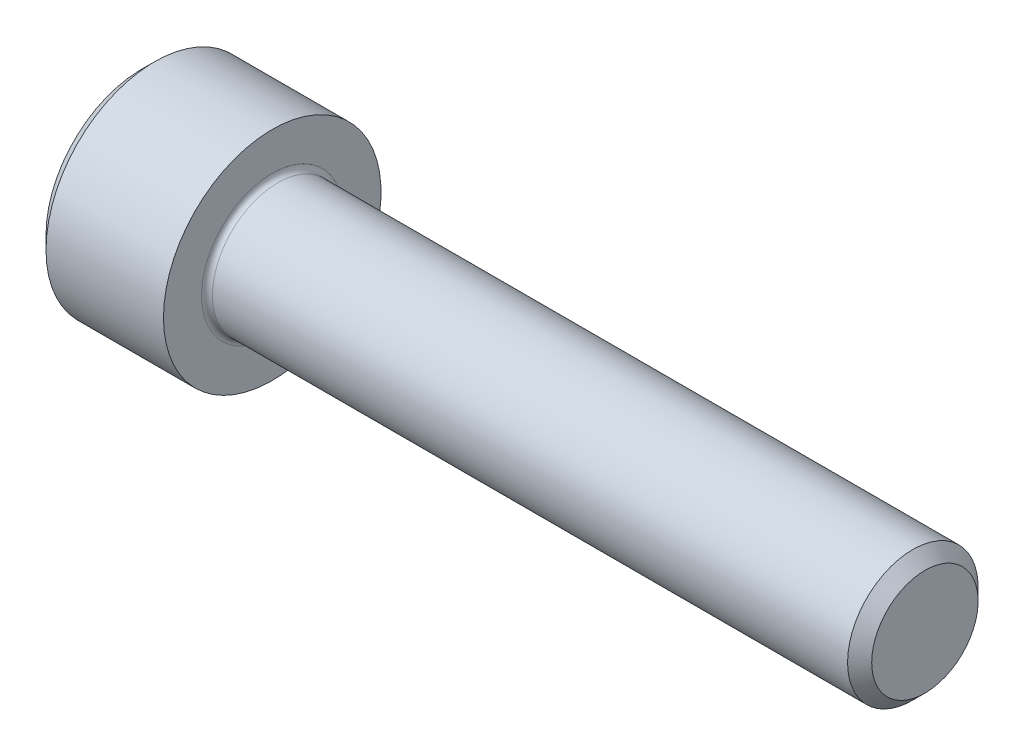
ISO-10303-21;
HEADER;
FILE_DESCRIPTION(('STEP AP214'),'2;1');
FILE_NAME('part.step','',(''),(''),'','','');
FILE_SCHEMA(('AUTOMOTIVE_DESIGN { 1 0 10303 214 1 1 1 1 }'));
ENDSEC;
DATA;
#1=APPLICATION_CONTEXT('core data for automotive mechanical design processes');
#2=APPLICATION_PROTOCOL_DEFINITION('international standard','automotive_design',2000,#1);
#3=PRODUCT_CONTEXT('',#1,'mechanical');
#4=PRODUCT('Part','Part','',(#3));
#5=PRODUCT_RELATED_PRODUCT_CATEGORY('part','',(#4));
#6=PRODUCT_DEFINITION_FORMATION('','',#4);
#7=PRODUCT_DEFINITION_CONTEXT('part definition',#1,'design');
#8=PRODUCT_DEFINITION('design','',#6,#7);
#9=PRODUCT_DEFINITION_SHAPE('','',#8);
#10=(LENGTH_UNIT() NAMED_UNIT(*) SI_UNIT(.MILLI.,.METRE.));
#11=(NAMED_UNIT(*) PLANE_ANGLE_UNIT() SI_UNIT($,.RADIAN.));
#12=(NAMED_UNIT(*) SI_UNIT($,.STERADIAN.) SOLID_ANGLE_UNIT());
#13=UNCERTAINTY_MEASURE_WITH_UNIT(LENGTH_MEASURE(1.E-05),#10,'distance_accuracy_value','');
#14=(GEOMETRIC_REPRESENTATION_CONTEXT(3) GLOBAL_UNCERTAINTY_ASSIGNED_CONTEXT((#13)) GLOBAL_UNIT_ASSIGNED_CONTEXT((#10,
#11,#12)) REPRESENTATION_CONTEXT('',''));
#15=CARTESIAN_POINT('',(0.,0.,0.));
#16=DIRECTION('',(0.,0.,1.));
#17=DIRECTION('',(1.,0.,0.));
#18=AXIS2_PLACEMENT_3D('',#15,#16,#17);
#19=CARTESIAN_POINT('',(0.,0.,0.));
#20=DIRECTION('',(-1.,0.,0.));
#21=DIRECTION('',(0.,0.,1.));
#22=AXIS2_PLACEMENT_3D('',#19,#20,#21);
#23=PLANE('',#22);
#24=DIRECTION('',(0.,-0.499999999999998,0.866025403784439));
#25=VECTOR('',#24,1.);
#26=CARTESIAN_POINT('',(0.,2.93524876856005,0.));
#27=LINE('',#26,#25);
#28=CARTESIAN_POINT('',(0.,2.93524876856005,0.));
#29=VERTEX_POINT('',#28);
#30=CARTESIAN_POINT('',(0.,1.46762438428003,2.542));
#31=VERTEX_POINT('',#30);
#32=EDGE_CURVE('E259',#29,#31,#27,.T.);
#33=ORIENTED_EDGE('',*,*,#32,.T.);
#34=DIRECTION('',(0.,1.,0.));
#35=VECTOR('',#34,1.);
#36=CARTESIAN_POINT('',(0.,-1.46762438428003,2.542));
#37=LINE('',#36,#35);
#38=CARTESIAN_POINT('',(0.,-1.46762438428003,2.542));
#39=VERTEX_POINT('',#38);
#40=EDGE_CURVE('E130',#39,#31,#37,.T.);
#41=ORIENTED_EDGE('',*,*,#40,.F.);
#42=DIRECTION('',(0.,-0.500000000000001,-0.866025403784438));
#43=VECTOR('',#42,1.);
#44=CARTESIAN_POINT('',(0.,-1.46762438428003,2.542));
#45=LINE('',#44,#43);
#46=CARTESIAN_POINT('',(0.,-2.93524876856006,0.));
#47=VERTEX_POINT('',#46);
#48=EDGE_CURVE('E262',#39,#47,#45,.T.);
#49=ORIENTED_EDGE('',*,*,#48,.T.);
#50=DIRECTION('',(0.,0.499999999999998,-0.86602540378444));
#51=VECTOR('',#50,1.);
#52=CARTESIAN_POINT('',(0.,-2.93524876856006,0.));
#53=LINE('',#52,#51);
#54=CARTESIAN_POINT('',(0.,-1.46762438428004,-2.542));
#55=VERTEX_POINT('',#54);
#56=EDGE_CURVE('E265',#47,#55,#53,.T.);
#57=ORIENTED_EDGE('',*,*,#56,.T.);
#58=DIRECTION('',(0.,-1.,0.));
#59=VECTOR('',#58,1.);
#60=CARTESIAN_POINT('',(0.,1.46762438428002,-2.542));
#61=LINE('',#60,#59);
#62=CARTESIAN_POINT('',(0.,1.46762438428002,-2.542));
#63=VERTEX_POINT('',#62);
#64=EDGE_CURVE('E268',#63,#55,#61,.T.);
#65=ORIENTED_EDGE('',*,*,#64,.F.);
#66=DIRECTION('',(0.,-0.500000000000001,-0.866025403784438));
#67=VECTOR('',#66,1.);
#68=CARTESIAN_POINT('',(0.,2.93524876856005,0.));
#69=LINE('',#68,#67);
#70=EDGE_CURVE('E125',#29,#63,#69,.T.);
#71=ORIENTED_EDGE('',*,*,#70,.F.);
#72=EDGE_LOOP('',(#33,#41,#49,#57,#65,#71));
#73=FACE_BOUND('',#72,.T.);
#74=CARTESIAN_POINT('',(0.,0.,0.));
#75=DIRECTION('',(-1.,0.,0.));
#76=DIRECTION('',(0.,0.,1.));
#77=AXIS2_PLACEMENT_3D('',#74,#75,#76);
#78=CIRCLE('',#77,4.4);
#79=CARTESIAN_POINT('',(0.,0.,4.4));
#80=VERTEX_POINT('',#79);
#81=EDGE_CURVE('E154',#80,#80,#78,.T.);
#82=ORIENTED_EDGE('',*,*,#81,.T.);
#83=EDGE_LOOP('',(#82));
#84=FACE_BOUND('',#83,.T.);
#85=ADVANCED_FACE('F34',(#73,#84),#23,.T.);
#86=CARTESIAN_POINT('',(0.,0.,0.));
#87=DIRECTION('',(1.,0.,0.));
#88=DIRECTION('',(0.,0.,-1.));
#89=AXIS2_PLACEMENT_3D('',#86,#87,#88);
#90=CONICAL_SURFACE('',#89,4.4,0.785398163397443);
#91=CARTESIAN_POINT('',(0.600000000000003,0.,0.));
#92=DIRECTION('',(-1.,0.,0.));
#93=DIRECTION('',(0.,0.,1.));
#94=AXIS2_PLACEMENT_3D('',#91,#92,#93);
#95=CIRCLE('',#94,5.);
#96=CARTESIAN_POINT('',(0.600000000000003,0.,5.));
#97=VERTEX_POINT('',#96);
#98=EDGE_CURVE('E151',#97,#97,#95,.T.);
#99=ORIENTED_EDGE('',*,*,#98,.T.);
#100=EDGE_LOOP('',(#99));
#101=FACE_BOUND('',#100,.T.);
#102=ORIENTED_EDGE('',*,*,#81,.F.);
#103=EDGE_LOOP('',(#102));
#104=FACE_BOUND('',#103,.T.);
#105=ADVANCED_FACE('F175',(#101,#104),#90,.T.);
#106=CARTESIAN_POINT('',(-31.75,0.,0.));
#107=DIRECTION('',(-1.,0.,0.));
#108=DIRECTION('',(0.,0.,1.));
#109=AXIS2_PLACEMENT_3D('',#106,#107,#108);
#110=CYLINDRICAL_SURFACE('',#109,5.);
#111=CARTESIAN_POINT('',(6.,0.,0.));
#112=DIRECTION('',(-1.,0.,0.));
#113=DIRECTION('',(0.,0.,1.));
#114=AXIS2_PLACEMENT_3D('',#111,#112,#113);
#115=CIRCLE('',#114,5.);
#116=CARTESIAN_POINT('',(6.,0.,5.));
#117=VERTEX_POINT('',#116);
#118=EDGE_CURVE('E148',#117,#117,#115,.T.);
#119=ORIENTED_EDGE('',*,*,#118,.T.);
#120=EDGE_LOOP('',(#119));
#121=FACE_BOUND('',#120,.T.);
#122=ORIENTED_EDGE('',*,*,#98,.F.);
#123=EDGE_LOOP('',(#122));
#124=FACE_BOUND('',#123,.T.);
#125=ADVANCED_FACE('F180',(#121,#124),#110,.T.);
#126=CARTESIAN_POINT('',(6.,5.,0.));
#127=DIRECTION('',(1.,0.,0.));
#128=DIRECTION('',(0.,0.,-1.));
#129=AXIS2_PLACEMENT_3D('',#126,#127,#128);
#130=PLANE('',#129);
#131=CARTESIAN_POINT('',(6.,0.,0.));
#132=DIRECTION('',(1.,0.,0.));
#133=DIRECTION('',(0.,0.,-1.));
#134=AXIS2_PLACEMENT_3D('',#131,#132,#133);
#135=CIRCLE('',#134,3.24999999999996);
#136=CARTESIAN_POINT('',(6.,0.,-3.24999999999996));
#137=VERTEX_POINT('',#136);
#138=EDGE_CURVE('E42',#137,#137,#135,.F.);
#139=ORIENTED_EDGE('',*,*,#138,.T.);
#140=EDGE_LOOP('',(#139));
#141=FACE_BOUND('',#140,.T.);
#142=ORIENTED_EDGE('',*,*,#118,.F.);
#143=EDGE_LOOP('',(#142));
#144=FACE_BOUND('',#143,.T.);
#145=ADVANCED_FACE('F159',(#141,#144),#130,.T.);
#146=CARTESIAN_POINT('',(-31.75,0.,0.));
#147=DIRECTION('',(-1.,0.,0.));
#148=DIRECTION('',(0.,0.,1.));
#149=AXIS2_PLACEMENT_3D('',#146,#147,#148);
#150=CYLINDRICAL_SURFACE('',#149,2.99999999999996);
#151=CARTESIAN_POINT('',(6.25,0.,0.));
#152=DIRECTION('',(1.,0.,0.));
#153=DIRECTION('',(0.,0.,-1.));
#154=AXIS2_PLACEMENT_3D('',#151,#152,#153);
#155=CIRCLE('',#154,2.99999999999996);
#156=CARTESIAN_POINT('',(6.25,0.,-2.99999999999996));
#157=VERTEX_POINT('',#156);
#158=EDGE_CURVE('E11',#157,#157,#155,.T.);
#159=ORIENTED_EDGE('',*,*,#158,.T.);
#160=EDGE_LOOP('',(#159));
#161=FACE_BOUND('',#160,.T.);
#162=CARTESIAN_POINT('',(35.4454999999999,0.,0.));
#163=DIRECTION('',(-1.,0.,0.));
#164=DIRECTION('',(0.,0.,1.));
#165=AXIS2_PLACEMENT_3D('',#162,#163,#164);
#166=CIRCLE('',#165,2.99999999999991);
#167=CARTESIAN_POINT('',(35.4454999999999,0.,2.99999999999991));
#168=VERTEX_POINT('',#167);
#169=EDGE_CURVE('E145',#168,#168,#166,.T.);
#170=ORIENTED_EDGE('',*,*,#169,.T.);
#171=EDGE_LOOP('',(#170));
#172=FACE_BOUND('',#171,.T.);
#173=ADVANCED_FACE('F190',(#161,#172),#150,.T.);
#174=CARTESIAN_POINT('',(36.,0.,0.));
#175=DIRECTION('',(-1.,0.,0.));
#176=DIRECTION('',(0.,0.,1.));
#177=AXIS2_PLACEMENT_3D('',#174,#175,#176);
#178=CONICAL_SURFACE('',#177,2.4455,0.78539816339732);
#179=ORIENTED_EDGE('',*,*,#169,.F.);
#180=EDGE_LOOP('',(#179));
#181=FACE_BOUND('',#180,.T.);
#182=CARTESIAN_POINT('',(36.,0.,0.));
#183=DIRECTION('',(-1.,0.,0.));
#184=DIRECTION('',(0.,0.,1.));
#185=AXIS2_PLACEMENT_3D('',#182,#183,#184);
#186=CIRCLE('',#185,2.4455);
#187=CARTESIAN_POINT('',(36.,0.,2.4455));
#188=VERTEX_POINT('',#187);
#189=EDGE_CURVE('E141',#188,#188,#186,.T.);
#190=ORIENTED_EDGE('',*,*,#189,.T.);
#191=EDGE_LOOP('',(#190));
#192=FACE_BOUND('',#191,.T.);
#193=ADVANCED_FACE('F170',(#181,#192),#178,.T.);
#194=CARTESIAN_POINT('',(36.,2.4455,0.));
#195=DIRECTION('',(1.,0.,0.));
#196=DIRECTION('',(0.,0.,-1.));
#197=AXIS2_PLACEMENT_3D('',#194,#195,#196);
#198=PLANE('',#197);
#199=ORIENTED_EDGE('',*,*,#189,.F.);
#200=EDGE_LOOP('',(#199));
#201=FACE_BOUND('',#200,.T.);
#202=ADVANCED_FACE('F163',(#201),#198,.T.);
#203=CARTESIAN_POINT('',(6.25,0.,0.));
#204=DIRECTION('',(1.,0.,0.));
#205=DIRECTION('',(0.,0.,-1.));
#206=AXIS2_PLACEMENT_3D('',#203,#204,#205);
#207=TOROIDAL_SURFACE('',#206,3.24999999999996,0.25);
#208=ORIENTED_EDGE('',*,*,#158,.F.);
#209=EDGE_LOOP('',(#208));
#210=FACE_BOUND('',#209,.T.);
#211=ORIENTED_EDGE('',*,*,#138,.F.);
#212=EDGE_LOOP('',(#211));
#213=FACE_BOUND('',#212,.T.);
#214=ADVANCED_FACE('F36',(#210,#213),#207,.F.);
#215=CARTESIAN_POINT('',(3.,2.93524876856005,0.));
#216=DIRECTION('',(0.,-0.86602540378444,-0.499999999999999));
#217=DIRECTION('',(0.,0.499999999999999,-0.86602540378444));
#218=AXIS2_PLACEMENT_3D('',#215,#216,#217);
#219=PLANE('',#218);
#220=ORIENTED_EDGE('',*,*,#32,.F.);
#221=DIRECTION('',(-1.,0.,0.));
#222=VECTOR('',#221,1.);
#223=CARTESIAN_POINT('',(3.,2.93524876856005,0.));
#224=LINE('',#223,#222);
#225=CARTESIAN_POINT('',(3.,2.93524876856005,0.));
#226=VERTEX_POINT('',#225);
#227=EDGE_CURVE('E249',#226,#29,#224,.T.);
#228=ORIENTED_EDGE('',*,*,#227,.F.);
#229=DIRECTION('',(0.,-0.499999999999998,0.866025403784439));
#230=VECTOR('',#229,1.);
#231=CARTESIAN_POINT('',(3.,2.93524876856005,0.));
#232=LINE('',#231,#230);
#233=CARTESIAN_POINT('',(3.,2.20143657642004,1.27099999999999));
#234=VERTEX_POINT('',#233);
#235=EDGE_CURVE('E117',#226,#234,#232,.T.);
#236=ORIENTED_EDGE('',*,*,#235,.T.);
#237=CARTESIAN_POINT('',(3.,1.46762438428003,2.542));
#238=VERTEX_POINT('',#237);
#239=EDGE_CURVE('E108',#234,#238,#232,.T.);
#240=ORIENTED_EDGE('',*,*,#239,.T.);
#241=DIRECTION('',(-1.,0.,0.));
#242=VECTOR('',#241,1.);
#243=CARTESIAN_POINT('',(3.,1.46762438428003,2.542));
#244=LINE('',#243,#242);
#245=EDGE_CURVE('E122',#238,#31,#244,.T.);
#246=ORIENTED_EDGE('',*,*,#245,.T.);
#247=EDGE_LOOP('',(#220,#228,#236,#240,#246));
#248=FACE_BOUND('',#247,.T.);
#249=ADVANCED_FACE('F121',(#248),#219,.T.);
#250=CARTESIAN_POINT('',(3.,-1.46762438428003,2.542));
#251=DIRECTION('',(0.,0.,1.));
#252=DIRECTION('',(0.,-1.,0.));
#253=AXIS2_PLACEMENT_3D('',#250,#251,#252);
#254=PLANE('',#253);
#255=ORIENTED_EDGE('',*,*,#40,.T.);
#256=ORIENTED_EDGE('',*,*,#245,.F.);
#257=DIRECTION('',(0.,1.,0.));
#258=VECTOR('',#257,1.);
#259=CARTESIAN_POINT('',(3.,-1.46762438428003,2.542));
#260=LINE('',#259,#258);
#261=CARTESIAN_POINT('',(3.,0.,2.542));
#262=VERTEX_POINT('',#261);
#263=EDGE_CURVE('E105',#262,#238,#260,.T.);
#264=ORIENTED_EDGE('',*,*,#263,.F.);
#265=CARTESIAN_POINT('',(3.,-1.46762438428003,2.542));
#266=VERTEX_POINT('',#265);
#267=EDGE_CURVE('E116',#266,#262,#260,.T.);
#268=ORIENTED_EDGE('',*,*,#267,.F.);
#269=DIRECTION('',(-1.,0.,0.));
#270=VECTOR('',#269,1.);
#271=CARTESIAN_POINT('',(3.,-1.46762438428003,2.542));
#272=LINE('',#271,#270);
#273=EDGE_CURVE('E132',#266,#39,#272,.T.);
#274=ORIENTED_EDGE('',*,*,#273,.T.);
#275=EDGE_LOOP('',(#255,#256,#264,#268,#274));
#276=FACE_BOUND('',#275,.T.);
#277=ADVANCED_FACE('F127',(#276),#254,.F.);
#278=CARTESIAN_POINT('',(3.,-1.46762438428003,2.542));
#279=DIRECTION('',(0.,0.866025403784438,-0.500000000000001));
#280=DIRECTION('',(0.,0.500000000000001,0.866025403784438));
#281=AXIS2_PLACEMENT_3D('',#278,#279,#280);
#282=PLANE('',#281);
#283=ORIENTED_EDGE('',*,*,#48,.F.);
#284=ORIENTED_EDGE('',*,*,#273,.F.);
#285=DIRECTION('',(0.,-0.500000000000001,-0.866025403784438));
#286=VECTOR('',#285,1.);
#287=CARTESIAN_POINT('',(3.,-1.46762438428003,2.542));
#288=LINE('',#287,#286);
#289=CARTESIAN_POINT('',(3.,-2.20143657642004,1.271));
#290=VERTEX_POINT('',#289);
#291=EDGE_CURVE('E288',#266,#290,#288,.T.);
#292=ORIENTED_EDGE('',*,*,#291,.T.);
#293=CARTESIAN_POINT('',(3.,-2.93524876856006,0.));
#294=VERTEX_POINT('',#293);
#295=EDGE_CURVE('E277',#290,#294,#288,.T.);
#296=ORIENTED_EDGE('',*,*,#295,.T.);
#297=DIRECTION('',(-1.,0.,0.));
#298=VECTOR('',#297,1.);
#299=CARTESIAN_POINT('',(3.,-2.93524876856006,0.));
#300=LINE('',#299,#298);
#301=EDGE_CURVE('E137',#294,#47,#300,.T.);
#302=ORIENTED_EDGE('',*,*,#301,.T.);
#303=EDGE_LOOP('',(#283,#284,#292,#296,#302));
#304=FACE_BOUND('',#303,.T.);
#305=ADVANCED_FACE('F203',(#304),#282,.T.);
#306=CARTESIAN_POINT('',(3.,-2.93524876856006,0.));
#307=DIRECTION('',(0.,0.86602540378444,0.499999999999998));
#308=DIRECTION('',(0.,-0.499999999999998,0.86602540378444));
#309=AXIS2_PLACEMENT_3D('',#306,#307,#308);
#310=PLANE('',#309);
#311=ORIENTED_EDGE('',*,*,#56,.F.);
#312=ORIENTED_EDGE('',*,*,#301,.F.);
#313=DIRECTION('',(0.,0.499999999999998,-0.86602540378444));
#314=VECTOR('',#313,1.);
#315=CARTESIAN_POINT('',(3.,-2.93524876856006,0.));
#316=LINE('',#315,#314);
#317=CARTESIAN_POINT('',(3.,-2.20143657642005,-1.271));
#318=VERTEX_POINT('',#317);
#319=EDGE_CURVE('E255',#294,#318,#316,.T.);
#320=ORIENTED_EDGE('',*,*,#319,.T.);
#321=CARTESIAN_POINT('',(3.,-1.46762438428004,-2.542));
#322=VERTEX_POINT('',#321);
#323=EDGE_CURVE('E287',#318,#322,#316,.T.);
#324=ORIENTED_EDGE('',*,*,#323,.T.);
#325=DIRECTION('',(-1.,0.,0.));
#326=VECTOR('',#325,1.);
#327=CARTESIAN_POINT('',(3.,-1.46762438428004,-2.542));
#328=LINE('',#327,#326);
#329=EDGE_CURVE('E248',#322,#55,#328,.T.);
#330=ORIENTED_EDGE('',*,*,#329,.T.);
#331=EDGE_LOOP('',(#311,#312,#320,#324,#330));
#332=FACE_BOUND('',#331,.T.);
#333=ADVANCED_FACE('F206',(#332),#310,.T.);
#334=CARTESIAN_POINT('',(3.,1.46762438428002,-2.542));
#335=DIRECTION('',(0.,0.,-1.));
#336=DIRECTION('',(0.,1.,0.));
#337=AXIS2_PLACEMENT_3D('',#334,#335,#336);
#338=PLANE('',#337);
#339=ORIENTED_EDGE('',*,*,#64,.T.);
#340=ORIENTED_EDGE('',*,*,#329,.F.);
#341=DIRECTION('',(0.,-1.,0.));
#342=VECTOR('',#341,1.);
#343=CARTESIAN_POINT('',(3.,1.46762438428002,-2.542));
#344=LINE('',#343,#342);
#345=CARTESIAN_POINT('',(3.,0.,-2.542));
#346=VERTEX_POINT('',#345);
#347=EDGE_CURVE('E252',#346,#322,#344,.T.);
#348=ORIENTED_EDGE('',*,*,#347,.F.);
#349=CARTESIAN_POINT('',(3.,1.46762438428002,-2.542));
#350=VERTEX_POINT('',#349);
#351=EDGE_CURVE('E49',#350,#346,#344,.T.);
#352=ORIENTED_EDGE('',*,*,#351,.F.);
#353=DIRECTION('',(-1.,0.,0.));
#354=VECTOR('',#353,1.);
#355=CARTESIAN_POINT('',(3.,1.46762438428002,-2.542));
#356=LINE('',#355,#354);
#357=EDGE_CURVE('E245',#350,#63,#356,.T.);
#358=ORIENTED_EDGE('',*,*,#357,.T.);
#359=EDGE_LOOP('',(#339,#340,#348,#352,#358));
#360=FACE_BOUND('',#359,.T.);
#361=ADVANCED_FACE('F210',(#360),#338,.F.);
#362=CARTESIAN_POINT('',(3.,2.93524876856005,0.));
#363=DIRECTION('',(0.,0.866025403784438,-0.500000000000001));
#364=DIRECTION('',(0.,0.500000000000001,0.866025403784438));
#365=AXIS2_PLACEMENT_3D('',#362,#363,#364);
#366=PLANE('',#365);
#367=ORIENTED_EDGE('',*,*,#70,.T.);
#368=ORIENTED_EDGE('',*,*,#357,.F.);
#369=DIRECTION('',(0.,-0.500000000000001,-0.866025403784438));
#370=VECTOR('',#369,1.);
#371=CARTESIAN_POINT('',(3.,2.93524876856005,0.));
#372=LINE('',#371,#370);
#373=CARTESIAN_POINT('',(3.,2.20143657642004,-1.271));
#374=VERTEX_POINT('',#373);
#375=EDGE_CURVE('E235',#374,#350,#372,.T.);
#376=ORIENTED_EDGE('',*,*,#375,.F.);
#377=EDGE_CURVE('E241',#226,#374,#372,.T.);
#378=ORIENTED_EDGE('',*,*,#377,.F.);
#379=ORIENTED_EDGE('',*,*,#227,.T.);
#380=EDGE_LOOP('',(#367,#368,#376,#378,#379));
#381=FACE_BOUND('',#380,.T.);
#382=ADVANCED_FACE('F214',(#381),#366,.F.);
#383=CARTESIAN_POINT('',(3.,4.40287315284008,-2.54200000000001));
#384=DIRECTION('',(1.,0.,0.));
#385=DIRECTION('',(0.,0.,-1.));
#386=AXIS2_PLACEMENT_3D('',#383,#384,#385);
#387=PLANE('',#386);
#388=ORIENTED_EDGE('',*,*,#347,.T.);
#389=ORIENTED_EDGE('',*,*,#323,.F.);
#390=CARTESIAN_POINT('',(3.,0.,0.));
#391=DIRECTION('',(-1.,0.,0.));
#392=DIRECTION('',(0.,0.,1.));
#393=AXIS2_PLACEMENT_3D('',#390,#391,#392);
#394=CIRCLE('',#393,2.542);
#395=EDGE_CURVE('E283',#346,#318,#394,.T.);
#396=ORIENTED_EDGE('',*,*,#395,.F.);
#397=EDGE_LOOP('',(#388,#389,#396));
#398=FACE_BOUND('',#397,.T.);
#399=ADVANCED_FACE('F218',(#398),#387,.F.);
#400=ORIENTED_EDGE('',*,*,#319,.F.);
#401=ORIENTED_EDGE('',*,*,#295,.F.);
#402=EDGE_CURVE('E135',#318,#290,#394,.T.);
#403=ORIENTED_EDGE('',*,*,#402,.F.);
#404=EDGE_LOOP('',(#400,#401,#403));
#405=FACE_BOUND('',#404,.T.);
#406=ADVANCED_FACE('F221',(#405),#387,.F.);
#407=ORIENTED_EDGE('',*,*,#291,.F.);
#408=ORIENTED_EDGE('',*,*,#267,.T.);
#409=EDGE_CURVE('E131',#290,#262,#394,.T.);
#410=ORIENTED_EDGE('',*,*,#409,.F.);
#411=EDGE_LOOP('',(#407,#408,#410));
#412=FACE_BOUND('',#411,.T.);
#413=ADVANCED_FACE('F226',(#412),#387,.F.);
#414=ORIENTED_EDGE('',*,*,#263,.T.);
#415=ORIENTED_EDGE('',*,*,#239,.F.);
#416=EDGE_CURVE('E111',#262,#234,#394,.T.);
#417=ORIENTED_EDGE('',*,*,#416,.F.);
#418=EDGE_LOOP('',(#414,#415,#417));
#419=FACE_BOUND('',#418,.T.);
#420=ADVANCED_FACE('F107',(#419),#387,.F.);
#421=ORIENTED_EDGE('',*,*,#235,.F.);
#422=ORIENTED_EDGE('',*,*,#377,.T.);
#423=EDGE_CURVE('E142',#234,#374,#394,.T.);
#424=ORIENTED_EDGE('',*,*,#423,.F.);
#425=EDGE_LOOP('',(#421,#422,#424));
#426=FACE_BOUND('',#425,.T.);
#427=ADVANCED_FACE('F229',(#426),#387,.F.);
#428=ORIENTED_EDGE('',*,*,#375,.T.);
#429=ORIENTED_EDGE('',*,*,#351,.T.);
#430=EDGE_CURVE('E238',#374,#346,#394,.T.);
#431=ORIENTED_EDGE('',*,*,#430,.F.);
#432=EDGE_LOOP('',(#428,#429,#431));
#433=FACE_BOUND('',#432,.T.);
#434=ADVANCED_FACE('F199',(#433),#387,.F.);
#435=CARTESIAN_POINT('',(3.,0.,0.));
#436=DIRECTION('',(-1.,0.,0.));
#437=DIRECTION('',(0.,0.,1.));
#438=AXIS2_PLACEMENT_3D('',#435,#436,#437);
#439=CONICAL_SURFACE('',#438,2.542,1.04719755119659);
#440=CARTESIAN_POINT('',(4.46762438428004,0.,0.));
#441=VERTEX_POINT('',#440);
#442=VERTEX_LOOP('',#441);
#443=FACE_BOUND('',#442,.T.);
#444=ORIENTED_EDGE('',*,*,#416,.T.);
#445=ORIENTED_EDGE('',*,*,#423,.T.);
#446=ORIENTED_EDGE('',*,*,#430,.T.);
#447=ORIENTED_EDGE('',*,*,#395,.T.);
#448=ORIENTED_EDGE('',*,*,#402,.T.);
#449=ORIENTED_EDGE('',*,*,#409,.T.);
#450=EDGE_LOOP('',(#444,#445,#446,#447,#448,#449));
#451=FACE_BOUND('',#450,.T.);
#452=ADVANCED_FACE('F197',(#443,#451),#439,.F.);
#453=CLOSED_SHELL('',(#85,#105,#125,#145,#173,#193,#202,#214,#249,#277,#305,#333,#361,#382,#399,
#406,#413,#420,#427,#434,#452));
#454=MANIFOLD_SOLID_BREP('B2',#453);
#455=ADVANCED_BREP_SHAPE_REPRESENTATION('',(#18,#454),#14);
#456=SHAPE_DEFINITION_REPRESENTATION(#9,#455);
ENDSEC;
END-ISO-10303-21;
